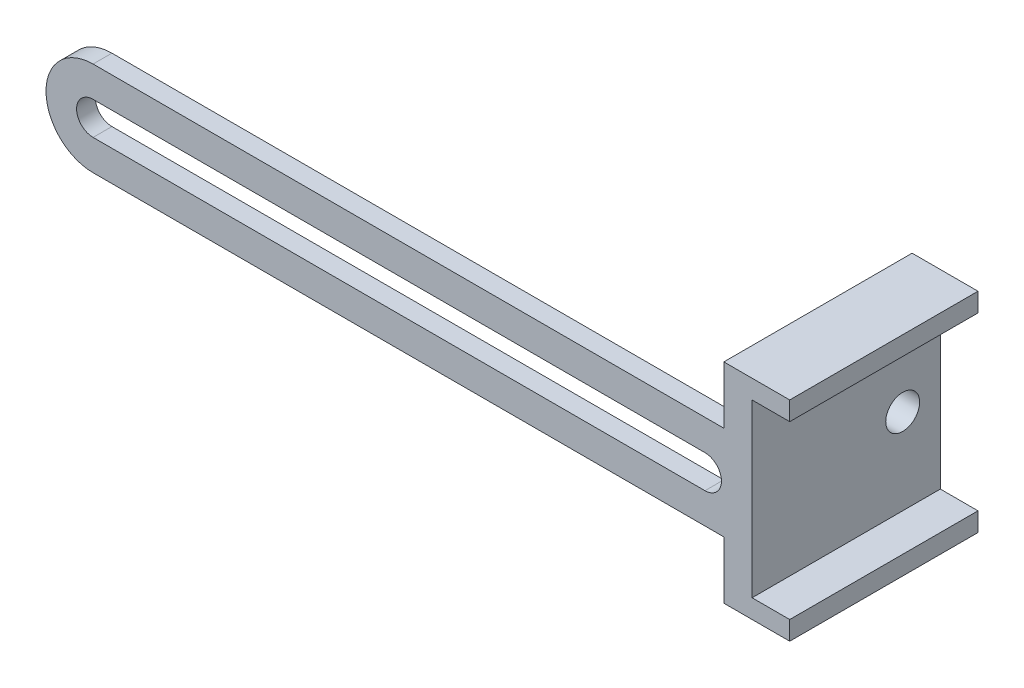
ISO-10303-21;
HEADER;
FILE_DESCRIPTION(('STEP AP214'),'2;1');
FILE_NAME('part.step','',(''),(''),'','','');
FILE_SCHEMA(('AUTOMOTIVE_DESIGN { 1 0 10303 214 1 1 1 1 }'));
ENDSEC;
DATA;
#1=APPLICATION_CONTEXT('core data for automotive mechanical design processes');
#2=APPLICATION_PROTOCOL_DEFINITION('international standard','automotive_design',2000,#1);
#3=PRODUCT_CONTEXT('',#1,'mechanical');
#4=PRODUCT('Part','Part','',(#3));
#5=PRODUCT_RELATED_PRODUCT_CATEGORY('part','',(#4));
#6=PRODUCT_DEFINITION_FORMATION('','',#4);
#7=PRODUCT_DEFINITION_CONTEXT('part definition',#1,'design');
#8=PRODUCT_DEFINITION('design','',#6,#7);
#9=PRODUCT_DEFINITION_SHAPE('','',#8);
#10=(LENGTH_UNIT() NAMED_UNIT(*) SI_UNIT(.MILLI.,.METRE.));
#11=(NAMED_UNIT(*) PLANE_ANGLE_UNIT() SI_UNIT($,.RADIAN.));
#12=(NAMED_UNIT(*) SI_UNIT($,.STERADIAN.) SOLID_ANGLE_UNIT());
#13=UNCERTAINTY_MEASURE_WITH_UNIT(LENGTH_MEASURE(1.E-05),#10,'distance_accuracy_value','');
#14=(GEOMETRIC_REPRESENTATION_CONTEXT(3) GLOBAL_UNCERTAINTY_ASSIGNED_CONTEXT((#13)) GLOBAL_UNIT_ASSIGNED_CONTEXT((#10,
#11,#12)) REPRESENTATION_CONTEXT('',''));
#15=CARTESIAN_POINT('',(0.,0.,0.));
#16=DIRECTION('',(0.,0.,1.));
#17=DIRECTION('',(1.,0.,0.));
#18=AXIS2_PLACEMENT_3D('',#15,#16,#17);
#19=CARTESIAN_POINT('',(0.,0.,-2.));
#20=DIRECTION('',(0.,0.,1.));
#21=DIRECTION('',(1.,0.,0.));
#22=AXIS2_PLACEMENT_3D('',#19,#20,#21);
#23=CYLINDRICAL_SURFACE('',#22,5.);
#24=CARTESIAN_POINT('',(0.,0.,0.));
#25=DIRECTION('',(0.,0.,1.));
#26=DIRECTION('',(1.,0.,0.));
#27=AXIS2_PLACEMENT_3D('',#24,#25,#26);
#28=CIRCLE('',#27,5.);
#29=CARTESIAN_POINT('',(0.,5.,0.));
#30=VERTEX_POINT('',#29);
#31=CARTESIAN_POINT('',(0.,-5.,0.));
#32=VERTEX_POINT('',#31);
#33=EDGE_CURVE('E254',#30,#32,#28,.T.);
#34=ORIENTED_EDGE('',*,*,#33,.F.);
#35=DIRECTION('',(0.,0.,1.));
#36=VECTOR('',#35,1.);
#37=CARTESIAN_POINT('',(0.,5.,-2.));
#38=LINE('',#37,#36);
#39=CARTESIAN_POINT('',(0.,5.,-2.));
#40=VERTEX_POINT('',#39);
#41=EDGE_CURVE('E11',#40,#30,#38,.T.);
#42=ORIENTED_EDGE('',*,*,#41,.F.);
#43=CARTESIAN_POINT('',(0.,0.,-2.));
#44=DIRECTION('',(0.,0.,1.));
#45=DIRECTION('',(1.,0.,0.));
#46=AXIS2_PLACEMENT_3D('',#43,#44,#45);
#47=CIRCLE('',#46,5.);
#48=CARTESIAN_POINT('',(0.,-5.,-2.));
#49=VERTEX_POINT('',#48);
#50=EDGE_CURVE('E260',#40,#49,#47,.T.);
#51=ORIENTED_EDGE('',*,*,#50,.T.);
#52=DIRECTION('',(0.,0.,1.));
#53=VECTOR('',#52,1.);
#54=CARTESIAN_POINT('',(0.,-5.,-2.));
#55=LINE('',#54,#53);
#56=EDGE_CURVE('E36',#49,#32,#55,.T.);
#57=ORIENTED_EDGE('',*,*,#56,.T.);
#58=EDGE_LOOP('',(#34,#42,#51,#57));
#59=FACE_BOUND('',#58,.T.);
#60=ADVANCED_FACE('F33',(#59),#23,.T.);
#61=CARTESIAN_POINT('',(0.,5.,-2.));
#62=DIRECTION('',(0.,1.,0.));
#63=DIRECTION('',(0.,0.,1.));
#64=AXIS2_PLACEMENT_3D('',#61,#62,#63);
#65=PLANE('',#64);
#66=DIRECTION('',(0.,0.,1.));
#67=VECTOR('',#66,1.);
#68=CARTESIAN_POINT('',(67.,5.,-2.));
#69=LINE('',#68,#67);
#70=CARTESIAN_POINT('',(67.,5.,-2.));
#71=VERTEX_POINT('',#70);
#72=CARTESIAN_POINT('',(67.,5.,0.));
#73=VERTEX_POINT('',#72);
#74=EDGE_CURVE('E229',#71,#73,#69,.T.);
#75=ORIENTED_EDGE('',*,*,#74,.F.);
#76=DIRECTION('',(-1.,0.,0.));
#77=VECTOR('',#76,1.);
#78=CARTESIAN_POINT('',(0.,5.,-2.));
#79=LINE('',#78,#77);
#80=EDGE_CURVE('E267',#71,#40,#79,.T.);
#81=ORIENTED_EDGE('',*,*,#80,.T.);
#82=ORIENTED_EDGE('',*,*,#41,.T.);
#83=DIRECTION('',(-1.,0.,0.));
#84=VECTOR('',#83,1.);
#85=CARTESIAN_POINT('',(0.,5.,0.));
#86=LINE('',#85,#84);
#87=EDGE_CURVE('E264',#73,#30,#86,.T.);
#88=ORIENTED_EDGE('',*,*,#87,.F.);
#89=EDGE_LOOP('',(#75,#81,#82,#88));
#90=FACE_BOUND('',#89,.T.);
#91=ADVANCED_FACE('F285',(#90),#65,.T.);
#92=CARTESIAN_POINT('',(70.,5.,-2.));
#93=DIRECTION('',(1.,0.,0.));
#94=DIRECTION('',(0.,0.,-1.));
#95=AXIS2_PLACEMENT_3D('',#92,#93,#94);
#96=PLANE('',#95);
#97=CARTESIAN_POINT('',(70.,0.,-16.));
#98=DIRECTION('',(1.,0.,0.));
#99=DIRECTION('',(0.,0.,-1.));
#100=AXIS2_PLACEMENT_3D('',#97,#98,#99);
#101=CIRCLE('',#100,1.8);
#102=CARTESIAN_POINT('',(70.,0.,-17.8));
#103=VERTEX_POINT('',#102);
#104=EDGE_CURVE('E178',#103,#103,#101,.T.);
#105=ORIENTED_EDGE('',*,*,#104,.F.);
#106=EDGE_LOOP('',(#105));
#107=FACE_BOUND('',#106,.T.);
#108=DIRECTION('',(0.,0.,1.));
#109=VECTOR('',#108,1.);
#110=CARTESIAN_POINT('',(70.,9.1,-20.));
#111=LINE('',#110,#109);
#112=CARTESIAN_POINT('',(70.,9.1,-20.));
#113=VERTEX_POINT('',#112);
#114=CARTESIAN_POINT('',(70.,9.1,0.));
#115=VERTEX_POINT('',#114);
#116=EDGE_CURVE('E218',#113,#115,#111,.T.);
#117=ORIENTED_EDGE('',*,*,#116,.T.);
#118=DIRECTION('',(0.,1.,0.));
#119=VECTOR('',#118,1.);
#120=CARTESIAN_POINT('',(70.,5.,0.));
#121=LINE('',#120,#119);
#122=CARTESIAN_POINT('',(70.,-9.1,0.));
#123=VERTEX_POINT('',#122);
#124=EDGE_CURVE('E274',#123,#115,#121,.T.);
#125=ORIENTED_EDGE('',*,*,#124,.F.);
#126=DIRECTION('',(0.,0.,1.));
#127=VECTOR('',#126,1.);
#128=CARTESIAN_POINT('',(70.,-9.1,-20.));
#129=LINE('',#128,#127);
#130=CARTESIAN_POINT('',(70.,-9.1,-20.));
#131=VERTEX_POINT('',#130);
#132=EDGE_CURVE('E221',#131,#123,#129,.T.);
#133=ORIENTED_EDGE('',*,*,#132,.F.);
#134=DIRECTION('',(0.,1.,0.));
#135=VECTOR('',#134,1.);
#136=CARTESIAN_POINT('',(70.,-9.1,-20.));
#137=LINE('',#136,#135);
#138=EDGE_CURVE('E182',#131,#113,#137,.T.);
#139=ORIENTED_EDGE('',*,*,#138,.T.);
#140=EDGE_LOOP('',(#117,#125,#133,#139));
#141=FACE_BOUND('',#140,.T.);
#142=ADVANCED_FACE('F308',(#107,#141),#96,.T.);
#143=CARTESIAN_POINT('',(0.,-5.,-2.));
#144=DIRECTION('',(0.,-1.,0.));
#145=DIRECTION('',(1.,0.,0.));
#146=AXIS2_PLACEMENT_3D('',#143,#144,#145);
#147=PLANE('',#146);
#148=DIRECTION('',(0.,0.,-1.));
#149=VECTOR('',#148,1.);
#150=CARTESIAN_POINT('',(67.,-5.,-2.));
#151=LINE('',#150,#149);
#152=CARTESIAN_POINT('',(67.,-5.,0.));
#153=VERTEX_POINT('',#152);
#154=CARTESIAN_POINT('',(67.,-5.,-2.));
#155=VERTEX_POINT('',#154);
#156=EDGE_CURVE('E227',#153,#155,#151,.T.);
#157=ORIENTED_EDGE('',*,*,#156,.F.);
#158=DIRECTION('',(1.,0.,0.));
#159=VECTOR('',#158,1.);
#160=CARTESIAN_POINT('',(0.,-5.,0.));
#161=LINE('',#160,#159);
#162=EDGE_CURVE('E271',#32,#153,#161,.T.);
#163=ORIENTED_EDGE('',*,*,#162,.F.);
#164=ORIENTED_EDGE('',*,*,#56,.F.);
#165=DIRECTION('',(1.,0.,0.));
#166=VECTOR('',#165,1.);
#167=CARTESIAN_POINT('',(0.,-5.,-2.));
#168=LINE('',#167,#166);
#169=EDGE_CURVE('E263',#49,#155,#168,.T.);
#170=ORIENTED_EDGE('',*,*,#169,.T.);
#171=EDGE_LOOP('',(#157,#163,#164,#170));
#172=FACE_BOUND('',#171,.T.);
#173=ADVANCED_FACE('F293',(#172),#147,.T.);
#174=CARTESIAN_POINT('',(0.,0.,-2.));
#175=DIRECTION('',(0.,0.,1.));
#176=DIRECTION('',(1.,0.,0.));
#177=AXIS2_PLACEMENT_3D('',#174,#175,#176);
#178=PLANE('',#177);
#179=DIRECTION('',(-1.,0.,0.));
#180=VECTOR('',#179,1.);
#181=CARTESIAN_POINT('',(0.,1.75,-2.));
#182=LINE('',#181,#180);
#183=CARTESIAN_POINT('',(65.,1.75,-2.));
#184=VERTEX_POINT('',#183);
#185=CARTESIAN_POINT('',(0.,1.75,-2.));
#186=VERTEX_POINT('',#185);
#187=EDGE_CURVE('E239',#184,#186,#182,.T.);
#188=ORIENTED_EDGE('',*,*,#187,.T.);
#189=CARTESIAN_POINT('',(0.,0.,-2.));
#190=DIRECTION('',(0.,0.,1.));
#191=DIRECTION('',(1.,0.,0.));
#192=AXIS2_PLACEMENT_3D('',#189,#190,#191);
#193=CIRCLE('',#192,1.75);
#194=CARTESIAN_POINT('',(0.,-1.75,-2.));
#195=VERTEX_POINT('',#194);
#196=EDGE_CURVE('E231',#186,#195,#193,.T.);
#197=ORIENTED_EDGE('',*,*,#196,.T.);
#198=DIRECTION('',(1.,0.,0.));
#199=VECTOR('',#198,1.);
#200=CARTESIAN_POINT('',(0.,-1.75,-2.));
#201=LINE('',#200,#199);
#202=CARTESIAN_POINT('',(65.,-1.75,-2.));
#203=VERTEX_POINT('',#202);
#204=EDGE_CURVE('E234',#195,#203,#201,.T.);
#205=ORIENTED_EDGE('',*,*,#204,.T.);
#206=CARTESIAN_POINT('',(65.,0.,-2.));
#207=DIRECTION('',(0.,0.,1.));
#208=DIRECTION('',(1.,0.,0.));
#209=AXIS2_PLACEMENT_3D('',#206,#207,#208);
#210=CIRCLE('',#209,1.75);
#211=EDGE_CURVE('E47',#203,#184,#210,.T.);
#212=ORIENTED_EDGE('',*,*,#211,.T.);
#213=EDGE_LOOP('',(#188,#197,#205,#212));
#214=FACE_BOUND('',#213,.T.);
#215=ORIENTED_EDGE('',*,*,#80,.F.);
#216=DIRECTION('',(0.,-1.,0.));
#217=VECTOR('',#216,1.);
#218=CARTESIAN_POINT('',(67.,0.,-2.));
#219=LINE('',#218,#217);
#220=EDGE_CURVE('E211',#71,#155,#219,.T.);
#221=ORIENTED_EDGE('',*,*,#220,.T.);
#222=ORIENTED_EDGE('',*,*,#169,.F.);
#223=ORIENTED_EDGE('',*,*,#50,.F.);
#224=EDGE_LOOP('',(#215,#221,#222,#223));
#225=FACE_BOUND('',#224,.T.);
#226=ADVANCED_FACE('F313',(#214,#225),#178,.F.);
#227=CARTESIAN_POINT('',(0.,0.,0.));
#228=DIRECTION('',(0.,0.,1.));
#229=DIRECTION('',(1.,0.,0.));
#230=AXIS2_PLACEMENT_3D('',#227,#228,#229);
#231=PLANE('',#230);
#232=ORIENTED_EDGE('',*,*,#162,.T.);
#233=DIRECTION('',(0.,-1.,0.));
#234=VECTOR('',#233,1.);
#235=CARTESIAN_POINT('',(67.,11.1,0.));
#236=LINE('',#235,#234);
#237=CARTESIAN_POINT('',(67.,-11.1,0.));
#238=VERTEX_POINT('',#237);
#239=EDGE_CURVE('E175',#153,#238,#236,.T.);
#240=ORIENTED_EDGE('',*,*,#239,.T.);
#241=DIRECTION('',(1.,0.,0.));
#242=VECTOR('',#241,1.);
#243=CARTESIAN_POINT('',(67.,-11.1,0.));
#244=LINE('',#243,#242);
#245=CARTESIAN_POINT('',(74.,-11.1,0.));
#246=VERTEX_POINT('',#245);
#247=EDGE_CURVE('E195',#238,#246,#244,.T.);
#248=ORIENTED_EDGE('',*,*,#247,.T.);
#249=DIRECTION('',(0.,1.,0.));
#250=VECTOR('',#249,1.);
#251=CARTESIAN_POINT('',(74.,-11.1,0.));
#252=LINE('',#251,#250);
#253=CARTESIAN_POINT('',(74.,-9.1,0.));
#254=VERTEX_POINT('',#253);
#255=EDGE_CURVE('E150',#246,#254,#252,.T.);
#256=ORIENTED_EDGE('',*,*,#255,.T.);
#257=DIRECTION('',(-1.,0.,0.));
#258=VECTOR('',#257,1.);
#259=CARTESIAN_POINT('',(74.,-9.1,0.));
#260=LINE('',#259,#258);
#261=EDGE_CURVE('E198',#254,#123,#260,.T.);
#262=ORIENTED_EDGE('',*,*,#261,.T.);
#263=ORIENTED_EDGE('',*,*,#124,.T.);
#264=DIRECTION('',(1.,0.,0.));
#265=VECTOR('',#264,1.);
#266=CARTESIAN_POINT('',(70.,9.1,0.));
#267=LINE('',#266,#265);
#268=CARTESIAN_POINT('',(74.,9.1,0.));
#269=VERTEX_POINT('',#268);
#270=EDGE_CURVE('E201',#115,#269,#267,.T.);
#271=ORIENTED_EDGE('',*,*,#270,.T.);
#272=DIRECTION('',(0.,1.,0.));
#273=VECTOR('',#272,1.);
#274=CARTESIAN_POINT('',(74.,9.1,0.));
#275=LINE('',#274,#273);
#276=CARTESIAN_POINT('',(74.,11.1,0.));
#277=VERTEX_POINT('',#276);
#278=EDGE_CURVE('E204',#269,#277,#275,.T.);
#279=ORIENTED_EDGE('',*,*,#278,.T.);
#280=DIRECTION('',(-1.,0.,0.));
#281=VECTOR('',#280,1.);
#282=CARTESIAN_POINT('',(74.,11.1,0.));
#283=LINE('',#282,#281);
#284=CARTESIAN_POINT('',(67.,11.1,0.));
#285=VERTEX_POINT('',#284);
#286=EDGE_CURVE('E207',#277,#285,#283,.T.);
#287=ORIENTED_EDGE('',*,*,#286,.T.);
#288=EDGE_CURVE('E172',#285,#73,#236,.T.);
#289=ORIENTED_EDGE('',*,*,#288,.T.);
#290=ORIENTED_EDGE('',*,*,#87,.T.);
#291=ORIENTED_EDGE('',*,*,#33,.T.);
#292=EDGE_LOOP('',(#232,#240,#248,#256,#262,#263,#271,#279,#287,#289,#290,#291));
#293=FACE_BOUND('',#292,.T.);
#294=CARTESIAN_POINT('',(0.,0.,0.));
#295=DIRECTION('',(0.,0.,1.));
#296=DIRECTION('',(1.,0.,0.));
#297=AXIS2_PLACEMENT_3D('',#294,#295,#296);
#298=CIRCLE('',#297,1.75);
#299=CARTESIAN_POINT('',(0.,1.75,0.));
#300=VERTEX_POINT('',#299);
#301=CARTESIAN_POINT('',(0.,-1.75,0.));
#302=VERTEX_POINT('',#301);
#303=EDGE_CURVE('E55',#300,#302,#298,.T.);
#304=ORIENTED_EDGE('',*,*,#303,.F.);
#305=DIRECTION('',(-1.,0.,0.));
#306=VECTOR('',#305,1.);
#307=CARTESIAN_POINT('',(0.,1.75,0.));
#308=LINE('',#307,#306);
#309=CARTESIAN_POINT('',(65.,1.75,0.));
#310=VERTEX_POINT('',#309);
#311=EDGE_CURVE('E235',#310,#300,#308,.T.);
#312=ORIENTED_EDGE('',*,*,#311,.F.);
#313=CARTESIAN_POINT('',(65.,0.,0.));
#314=DIRECTION('',(0.,0.,1.));
#315=DIRECTION('',(1.,0.,0.));
#316=AXIS2_PLACEMENT_3D('',#313,#314,#315);
#317=CIRCLE('',#316,1.75);
#318=CARTESIAN_POINT('',(65.,-1.75,0.));
#319=VERTEX_POINT('',#318);
#320=EDGE_CURVE('E247',#319,#310,#317,.T.);
#321=ORIENTED_EDGE('',*,*,#320,.F.);
#322=DIRECTION('',(1.,0.,0.));
#323=VECTOR('',#322,1.);
#324=CARTESIAN_POINT('',(0.,-1.75,0.));
#325=LINE('',#324,#323);
#326=EDGE_CURVE('E244',#302,#319,#325,.T.);
#327=ORIENTED_EDGE('',*,*,#326,.F.);
#328=EDGE_LOOP('',(#304,#312,#321,#327));
#329=FACE_BOUND('',#328,.T.);
#330=ADVANCED_FACE('F278',(#293,#329),#231,.T.);
#331=CARTESIAN_POINT('',(0.,0.,-2.));
#332=DIRECTION('',(0.,0.,1.));
#333=DIRECTION('',(1.,0.,0.));
#334=AXIS2_PLACEMENT_3D('',#331,#332,#333);
#335=CYLINDRICAL_SURFACE('',#334,1.75);
#336=ORIENTED_EDGE('',*,*,#303,.T.);
#337=DIRECTION('',(0.,0.,1.));
#338=VECTOR('',#337,1.);
#339=CARTESIAN_POINT('',(0.,-1.75,-2.));
#340=LINE('',#339,#338);
#341=EDGE_CURVE('E242',#195,#302,#340,.T.);
#342=ORIENTED_EDGE('',*,*,#341,.F.);
#343=ORIENTED_EDGE('',*,*,#196,.F.);
#344=DIRECTION('',(0.,0.,1.));
#345=VECTOR('',#344,1.);
#346=CARTESIAN_POINT('',(0.,1.75,-2.));
#347=LINE('',#346,#345);
#348=EDGE_CURVE('E252',#186,#300,#347,.T.);
#349=ORIENTED_EDGE('',*,*,#348,.T.);
#350=EDGE_LOOP('',(#336,#342,#343,#349));
#351=FACE_BOUND('',#350,.T.);
#352=ADVANCED_FACE('F321',(#351),#335,.F.);
#353=CARTESIAN_POINT('',(0.,1.75,-2.));
#354=DIRECTION('',(0.,1.,0.));
#355=DIRECTION('',(0.,0.,1.));
#356=AXIS2_PLACEMENT_3D('',#353,#354,#355);
#357=PLANE('',#356);
#358=ORIENTED_EDGE('',*,*,#311,.T.);
#359=ORIENTED_EDGE('',*,*,#348,.F.);
#360=ORIENTED_EDGE('',*,*,#187,.F.);
#361=DIRECTION('',(0.,0.,1.));
#362=VECTOR('',#361,1.);
#363=CARTESIAN_POINT('',(65.,1.75,-2.));
#364=LINE('',#363,#362);
#365=EDGE_CURVE('E255',#184,#310,#364,.T.);
#366=ORIENTED_EDGE('',*,*,#365,.T.);
#367=EDGE_LOOP('',(#358,#359,#360,#366));
#368=FACE_BOUND('',#367,.T.);
#369=ADVANCED_FACE('F366',(#368),#357,.F.);
#370=CARTESIAN_POINT('',(65.,0.,-2.));
#371=DIRECTION('',(0.,0.,1.));
#372=DIRECTION('',(1.,0.,0.));
#373=AXIS2_PLACEMENT_3D('',#370,#371,#372);
#374=CYLINDRICAL_SURFACE('',#373,1.75);
#375=ORIENTED_EDGE('',*,*,#320,.T.);
#376=ORIENTED_EDGE('',*,*,#365,.F.);
#377=ORIENTED_EDGE('',*,*,#211,.F.);
#378=DIRECTION('',(0.,0.,1.));
#379=VECTOR('',#378,1.);
#380=CARTESIAN_POINT('',(65.,-1.75,-2.));
#381=LINE('',#380,#379);
#382=EDGE_CURVE('E257',#203,#319,#381,.T.);
#383=ORIENTED_EDGE('',*,*,#382,.T.);
#384=EDGE_LOOP('',(#375,#376,#377,#383));
#385=FACE_BOUND('',#384,.T.);
#386=ADVANCED_FACE('F369',(#385),#374,.F.);
#387=CARTESIAN_POINT('',(0.,-1.75,-2.));
#388=DIRECTION('',(0.,-1.,0.));
#389=DIRECTION('',(0.,0.,-1.));
#390=AXIS2_PLACEMENT_3D('',#387,#388,#389);
#391=PLANE('',#390);
#392=ORIENTED_EDGE('',*,*,#326,.T.);
#393=ORIENTED_EDGE('',*,*,#382,.F.);
#394=ORIENTED_EDGE('',*,*,#204,.F.);
#395=ORIENTED_EDGE('',*,*,#341,.T.);
#396=EDGE_LOOP('',(#392,#393,#394,#395));
#397=FACE_BOUND('',#396,.T.);
#398=ADVANCED_FACE('F353',(#397),#391,.F.);
#399=CARTESIAN_POINT('',(67.,-11.1,-20.));
#400=DIRECTION('',(0.,-1.,0.));
#401=DIRECTION('',(0.,0.,-1.));
#402=AXIS2_PLACEMENT_3D('',#399,#400,#401);
#403=PLANE('',#402);
#404=ORIENTED_EDGE('',*,*,#247,.F.);
#405=DIRECTION('',(0.,0.,1.));
#406=VECTOR('',#405,1.);
#407=CARTESIAN_POINT('',(67.,-11.1,-20.));
#408=LINE('',#407,#406);
#409=CARTESIAN_POINT('',(67.,-11.1,-20.));
#410=VERTEX_POINT('',#409);
#411=EDGE_CURVE('E171',#410,#238,#408,.T.);
#412=ORIENTED_EDGE('',*,*,#411,.F.);
#413=DIRECTION('',(1.,0.,0.));
#414=VECTOR('',#413,1.);
#415=CARTESIAN_POINT('',(67.,-11.1,-20.));
#416=LINE('',#415,#414);
#417=CARTESIAN_POINT('',(74.,-11.1,-20.));
#418=VERTEX_POINT('',#417);
#419=EDGE_CURVE('E163',#410,#418,#416,.T.);
#420=ORIENTED_EDGE('',*,*,#419,.T.);
#421=DIRECTION('',(0.,0.,1.));
#422=VECTOR('',#421,1.);
#423=CARTESIAN_POINT('',(74.,-11.1,-20.));
#424=LINE('',#423,#422);
#425=EDGE_CURVE('E145',#418,#246,#424,.T.);
#426=ORIENTED_EDGE('',*,*,#425,.T.);
#427=EDGE_LOOP('',(#404,#412,#420,#426));
#428=FACE_BOUND('',#427,.T.);
#429=ADVANCED_FACE('F169',(#428),#403,.T.);
#430=CARTESIAN_POINT('',(67.,11.1,-20.));
#431=DIRECTION('',(-1.,0.,0.));
#432=DIRECTION('',(0.,0.,1.));
#433=AXIS2_PLACEMENT_3D('',#430,#431,#432);
#434=PLANE('',#433);
#435=CARTESIAN_POINT('',(67.,0.,-16.));
#436=DIRECTION('',(-1.,0.,0.));
#437=DIRECTION('',(0.,0.,1.));
#438=AXIS2_PLACEMENT_3D('',#435,#436,#437);
#439=CIRCLE('',#438,1.8);
#440=CARTESIAN_POINT('',(67.,0.,-14.2));
#441=VERTEX_POINT('',#440);
#442=EDGE_CURVE('E339',#441,#441,#439,.T.);
#443=ORIENTED_EDGE('',*,*,#442,.F.);
#444=EDGE_LOOP('',(#443));
#445=FACE_BOUND('',#444,.T.);
#446=ORIENTED_EDGE('',*,*,#220,.F.);
#447=ORIENTED_EDGE('',*,*,#74,.T.);
#448=ORIENTED_EDGE('',*,*,#288,.F.);
#449=DIRECTION('',(0.,0.,1.));
#450=VECTOR('',#449,1.);
#451=CARTESIAN_POINT('',(67.,11.1,-20.));
#452=LINE('',#451,#450);
#453=CARTESIAN_POINT('',(67.,11.1,-20.));
#454=VERTEX_POINT('',#453);
#455=EDGE_CURVE('E212',#454,#285,#452,.T.);
#456=ORIENTED_EDGE('',*,*,#455,.F.);
#457=DIRECTION('',(0.,-1.,0.));
#458=VECTOR('',#457,1.);
#459=CARTESIAN_POINT('',(67.,11.1,-20.));
#460=LINE('',#459,#458);
#461=EDGE_CURVE('E156',#454,#410,#460,.T.);
#462=ORIENTED_EDGE('',*,*,#461,.T.);
#463=ORIENTED_EDGE('',*,*,#411,.T.);
#464=ORIENTED_EDGE('',*,*,#239,.F.);
#465=ORIENTED_EDGE('',*,*,#156,.T.);
#466=EDGE_LOOP('',(#446,#447,#448,#456,#462,#463,#464,#465));
#467=FACE_BOUND('',#466,.T.);
#468=ADVANCED_FACE('F295',(#445,#467),#434,.T.);
#469=CARTESIAN_POINT('',(74.,11.1,-20.));
#470=DIRECTION('',(0.,1.,0.));
#471=DIRECTION('',(0.,0.,1.));
#472=AXIS2_PLACEMENT_3D('',#469,#470,#471);
#473=PLANE('',#472);
#474=ORIENTED_EDGE('',*,*,#286,.F.);
#475=DIRECTION('',(0.,0.,1.));
#476=VECTOR('',#475,1.);
#477=CARTESIAN_POINT('',(74.,11.1,-20.));
#478=LINE('',#477,#476);
#479=CARTESIAN_POINT('',(74.,11.1,-20.));
#480=VERTEX_POINT('',#479);
#481=EDGE_CURVE('E214',#480,#277,#478,.T.);
#482=ORIENTED_EDGE('',*,*,#481,.F.);
#483=DIRECTION('',(-1.,0.,0.));
#484=VECTOR('',#483,1.);
#485=CARTESIAN_POINT('',(74.,11.1,-20.));
#486=LINE('',#485,#484);
#487=EDGE_CURVE('E191',#480,#454,#486,.T.);
#488=ORIENTED_EDGE('',*,*,#487,.T.);
#489=ORIENTED_EDGE('',*,*,#455,.T.);
#490=EDGE_LOOP('',(#474,#482,#488,#489));
#491=FACE_BOUND('',#490,.T.);
#492=ADVANCED_FACE('F346',(#491),#473,.T.);
#493=CARTESIAN_POINT('',(74.,9.1,-20.));
#494=DIRECTION('',(1.,0.,0.));
#495=DIRECTION('',(0.,0.,-1.));
#496=AXIS2_PLACEMENT_3D('',#493,#494,#495);
#497=PLANE('',#496);
#498=ORIENTED_EDGE('',*,*,#278,.F.);
#499=DIRECTION('',(0.,0.,1.));
#500=VECTOR('',#499,1.);
#501=CARTESIAN_POINT('',(74.,9.1,-20.));
#502=LINE('',#501,#500);
#503=CARTESIAN_POINT('',(74.,9.1,-20.));
#504=VERTEX_POINT('',#503);
#505=EDGE_CURVE('E216',#504,#269,#502,.T.);
#506=ORIENTED_EDGE('',*,*,#505,.F.);
#507=DIRECTION('',(0.,1.,0.));
#508=VECTOR('',#507,1.);
#509=CARTESIAN_POINT('',(74.,9.1,-20.));
#510=LINE('',#509,#508);
#511=EDGE_CURVE('E188',#504,#480,#510,.T.);
#512=ORIENTED_EDGE('',*,*,#511,.T.);
#513=ORIENTED_EDGE('',*,*,#481,.T.);
#514=EDGE_LOOP('',(#498,#506,#512,#513));
#515=FACE_BOUND('',#514,.T.);
#516=ADVANCED_FACE('F302',(#515),#497,.T.);
#517=CARTESIAN_POINT('',(70.,9.1,-20.));
#518=DIRECTION('',(0.,-1.,0.));
#519=DIRECTION('',(0.,0.,-1.));
#520=AXIS2_PLACEMENT_3D('',#517,#518,#519);
#521=PLANE('',#520);
#522=ORIENTED_EDGE('',*,*,#270,.F.);
#523=ORIENTED_EDGE('',*,*,#116,.F.);
#524=DIRECTION('',(1.,0.,0.));
#525=VECTOR('',#524,1.);
#526=CARTESIAN_POINT('',(70.,9.1,-20.));
#527=LINE('',#526,#525);
#528=EDGE_CURVE('E185',#113,#504,#527,.T.);
#529=ORIENTED_EDGE('',*,*,#528,.T.);
#530=ORIENTED_EDGE('',*,*,#505,.T.);
#531=EDGE_LOOP('',(#522,#523,#529,#530));
#532=FACE_BOUND('',#531,.T.);
#533=ADVANCED_FACE('F306',(#532),#521,.T.);
#534=CARTESIAN_POINT('',(74.,-9.1,-20.));
#535=DIRECTION('',(0.,1.,0.));
#536=DIRECTION('',(0.,0.,1.));
#537=AXIS2_PLACEMENT_3D('',#534,#535,#536);
#538=PLANE('',#537);
#539=ORIENTED_EDGE('',*,*,#261,.F.);
#540=DIRECTION('',(0.,0.,1.));
#541=VECTOR('',#540,1.);
#542=CARTESIAN_POINT('',(74.,-9.1,-20.));
#543=LINE('',#542,#541);
#544=CARTESIAN_POINT('',(74.,-9.1,-20.));
#545=VERTEX_POINT('',#544);
#546=EDGE_CURVE('E155',#545,#254,#543,.T.);
#547=ORIENTED_EDGE('',*,*,#546,.F.);
#548=DIRECTION('',(-1.,0.,0.));
#549=VECTOR('',#548,1.);
#550=CARTESIAN_POINT('',(74.,-9.1,-20.));
#551=LINE('',#550,#549);
#552=EDGE_CURVE('E167',#545,#131,#551,.T.);
#553=ORIENTED_EDGE('',*,*,#552,.T.);
#554=ORIENTED_EDGE('',*,*,#132,.T.);
#555=EDGE_LOOP('',(#539,#547,#553,#554));
#556=FACE_BOUND('',#555,.T.);
#557=ADVANCED_FACE('F311',(#556),#538,.T.);
#558=CARTESIAN_POINT('',(74.,-11.1,-20.));
#559=DIRECTION('',(1.,0.,0.));
#560=DIRECTION('',(0.,0.,-1.));
#561=AXIS2_PLACEMENT_3D('',#558,#559,#560);
#562=PLANE('',#561);
#563=ORIENTED_EDGE('',*,*,#255,.F.);
#564=ORIENTED_EDGE('',*,*,#425,.F.);
#565=DIRECTION('',(0.,1.,0.));
#566=VECTOR('',#565,1.);
#567=CARTESIAN_POINT('',(74.,-11.1,-20.));
#568=LINE('',#567,#566);
#569=EDGE_CURVE('E148',#418,#545,#568,.T.);
#570=ORIENTED_EDGE('',*,*,#569,.T.);
#571=ORIENTED_EDGE('',*,*,#546,.T.);
#572=EDGE_LOOP('',(#563,#564,#570,#571));
#573=FACE_BOUND('',#572,.T.);
#574=ADVANCED_FACE('F147',(#573),#562,.T.);
#575=CARTESIAN_POINT('',(0.,0.,-20.));
#576=DIRECTION('',(0.,0.,1.));
#577=DIRECTION('',(1.,0.,0.));
#578=AXIS2_PLACEMENT_3D('',#575,#576,#577);
#579=PLANE('',#578);
#580=ORIENTED_EDGE('',*,*,#419,.F.);
#581=ORIENTED_EDGE('',*,*,#461,.F.);
#582=ORIENTED_EDGE('',*,*,#487,.F.);
#583=ORIENTED_EDGE('',*,*,#511,.F.);
#584=ORIENTED_EDGE('',*,*,#528,.F.);
#585=ORIENTED_EDGE('',*,*,#138,.F.);
#586=ORIENTED_EDGE('',*,*,#552,.F.);
#587=ORIENTED_EDGE('',*,*,#569,.F.);
#588=EDGE_LOOP('',(#580,#581,#582,#583,#584,#585,#586,#587));
#589=FACE_BOUND('',#588,.T.);
#590=ADVANCED_FACE('F161',(#589),#579,.F.);
#591=CARTESIAN_POINT('',(82.,0.,-16.));
#592=DIRECTION('',(-1.,0.,0.));
#593=DIRECTION('',(0.,0.,1.));
#594=AXIS2_PLACEMENT_3D('',#591,#592,#593);
#595=CYLINDRICAL_SURFACE('',#594,1.8);
#596=ORIENTED_EDGE('',*,*,#104,.T.);
#597=EDGE_LOOP('',(#596));
#598=FACE_BOUND('',#597,.T.);
#599=ORIENTED_EDGE('',*,*,#442,.T.);
#600=EDGE_LOOP('',(#599));
#601=FACE_BOUND('',#600,.T.);
#602=ADVANCED_FACE('F343',(#598,#601),#595,.F.);
#603=CLOSED_SHELL('',(#60,#91,#142,#173,#226,#330,#352,#369,#386,#398,#429,#468,#492,#516,#533,
#557,#574,#590,#602));
#604=MANIFOLD_SOLID_BREP('B2',#603);
#605=ADVANCED_BREP_SHAPE_REPRESENTATION('',(#18,#604),#14);
#606=SHAPE_DEFINITION_REPRESENTATION(#9,#605);
ENDSEC;
END-ISO-10303-21;
